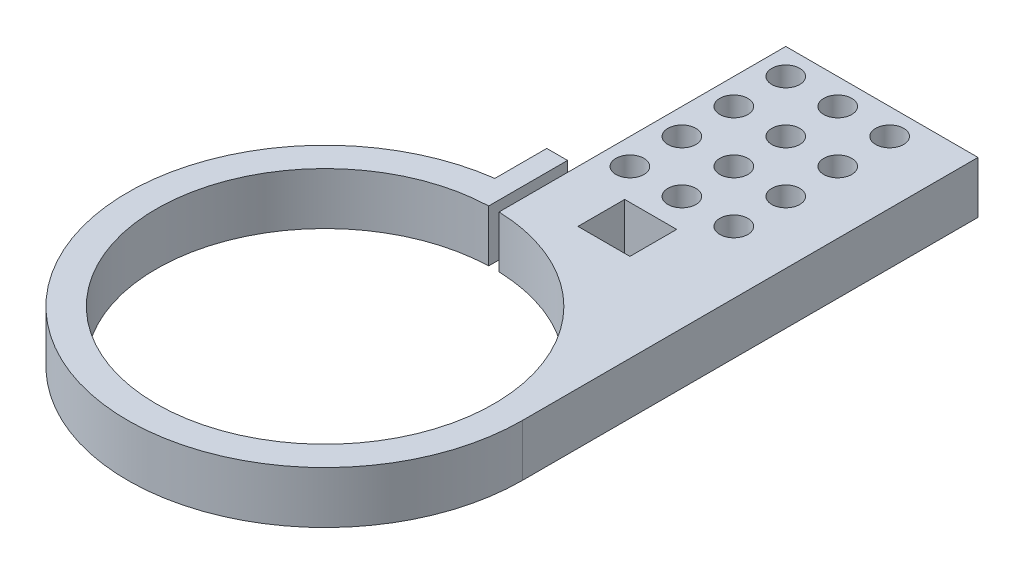
ISO-10303-21;
HEADER;
FILE_DESCRIPTION(('STEP AP214'),'2;1');
FILE_NAME('part.step','',(''),(''),'','','');
FILE_SCHEMA(('AUTOMOTIVE_DESIGN { 1 0 10303 214 1 1 1 1 }'));
ENDSEC;
DATA;
#1=APPLICATION_CONTEXT('core data for automotive mechanical design processes');
#2=APPLICATION_PROTOCOL_DEFINITION('international standard','automotive_design',2000,#1);
#3=PRODUCT_CONTEXT('',#1,'mechanical');
#4=PRODUCT('Part','Part','',(#3));
#5=PRODUCT_RELATED_PRODUCT_CATEGORY('part','',(#4));
#6=PRODUCT_DEFINITION_FORMATION('','',#4);
#7=PRODUCT_DEFINITION_CONTEXT('part definition',#1,'design');
#8=PRODUCT_DEFINITION('design','',#6,#7);
#9=PRODUCT_DEFINITION_SHAPE('','',#8);
#10=(LENGTH_UNIT() NAMED_UNIT(*) SI_UNIT(.MILLI.,.METRE.));
#11=(NAMED_UNIT(*) PLANE_ANGLE_UNIT() SI_UNIT($,.RADIAN.));
#12=(NAMED_UNIT(*) SI_UNIT($,.STERADIAN.) SOLID_ANGLE_UNIT());
#13=UNCERTAINTY_MEASURE_WITH_UNIT(LENGTH_MEASURE(1.E-05),#10,'distance_accuracy_value','');
#14=(GEOMETRIC_REPRESENTATION_CONTEXT(3) GLOBAL_UNCERTAINTY_ASSIGNED_CONTEXT((#13)) GLOBAL_UNIT_ASSIGNED_CONTEXT((#10,
#11,#12)) REPRESENTATION_CONTEXT('',''));
#15=CARTESIAN_POINT('',(0.,0.,0.));
#16=DIRECTION('',(0.,0.,1.));
#17=DIRECTION('',(1.,0.,0.));
#18=AXIS2_PLACEMENT_3D('',#15,#16,#17);
#19=CARTESIAN_POINT('',(0.,12.7,0.));
#20=DIRECTION('',(0.,-1.,0.));
#21=DIRECTION('',(0.,0.,-1.));
#22=AXIS2_PLACEMENT_3D('',#19,#20,#21);
#23=CYLINDRICAL_SURFACE('',#22,48.26);
#24=DIRECTION('',(0.,-1.,0.));
#25=VECTOR('',#24,1.);
#26=CARTESIAN_POINT('',(48.26,12.7,0.));
#27=LINE('',#26,#25);
#28=CARTESIAN_POINT('',(48.26,12.7,0.));
#29=VERTEX_POINT('',#28);
#30=CARTESIAN_POINT('',(48.26,0.,0.));
#31=VERTEX_POINT('',#30);
#32=EDGE_CURVE('E212',#29,#31,#27,.T.);
#33=ORIENTED_EDGE('',*,*,#32,.F.);
#34=CARTESIAN_POINT('',(0.,12.7,0.));
#35=DIRECTION('',(0.,1.,0.));
#36=DIRECTION('',(0.,0.,1.));
#37=AXIS2_PLACEMENT_3D('',#34,#35,#36);
#38=CIRCLE('',#37,48.26);
#39=CARTESIAN_POINT('',(-6.34999999999999,12.7,-47.8404128326669));
#40=VERTEX_POINT('',#39);
#41=EDGE_CURVE('E40',#40,#29,#38,.T.);
#42=ORIENTED_EDGE('',*,*,#41,.F.);
#43=DIRECTION('',(0.,-1.,0.));
#44=VECTOR('',#43,1.);
#45=CARTESIAN_POINT('',(-6.35,12.7,-47.8404128326669));
#46=LINE('',#45,#44);
#47=CARTESIAN_POINT('',(-6.35,0.,-47.8404128326669));
#48=VERTEX_POINT('',#47);
#49=EDGE_CURVE('E242',#40,#48,#46,.T.);
#50=ORIENTED_EDGE('',*,*,#49,.T.);
#51=CARTESIAN_POINT('',(0.,0.,0.));
#52=DIRECTION('',(0.,1.,0.));
#53=DIRECTION('',(0.,0.,1.));
#54=AXIS2_PLACEMENT_3D('',#51,#52,#53);
#55=CIRCLE('',#54,48.26);
#56=EDGE_CURVE('E249',#48,#31,#55,.T.);
#57=ORIENTED_EDGE('',*,*,#56,.T.);
#58=EDGE_LOOP('',(#33,#42,#50,#57));
#59=FACE_BOUND('',#58,.T.);
#60=ADVANCED_FACE('F33',(#59),#23,.T.);
#61=CARTESIAN_POINT('',(0.,12.7,0.));
#62=DIRECTION('',(0.,1.,0.));
#63=DIRECTION('',(0.,0.,1.));
#64=AXIS2_PLACEMENT_3D('',#61,#62,#63);
#65=PLANE('',#64);
#66=CARTESIAN_POINT('',(33.0200000000004,12.7,-66.8904128326669));
#67=DIRECTION('',(0.,1.,0.));
#68=DIRECTION('',(0.,0.,1.));
#69=AXIS2_PLACEMENT_3D('',#66,#67,#68);
#70=CIRCLE('',#69,3.42900000000001);
#71=CARTESIAN_POINT('',(33.0200000000004,12.7,-63.4614128326669));
#72=VERTEX_POINT('',#71);
#73=EDGE_CURVE('E185',#72,#72,#70,.T.);
#74=ORIENTED_EDGE('',*,*,#73,.F.);
#75=EDGE_LOOP('',(#74));
#76=FACE_BOUND('',#75,.T.);
#77=CARTESIAN_POINT('',(33.0200000000003,12.7,-79.5904128326669));
#78=DIRECTION('',(0.,1.,0.));
#79=DIRECTION('',(0.,0.,1.));
#80=AXIS2_PLACEMENT_3D('',#77,#78,#79);
#81=CIRCLE('',#80,3.42900000000001);
#82=CARTESIAN_POINT('',(33.0200000000003,12.7,-76.1614128326669));
#83=VERTEX_POINT('',#82);
#84=EDGE_CURVE('E179',#83,#83,#81,.T.);
#85=ORIENTED_EDGE('',*,*,#84,.F.);
#86=EDGE_LOOP('',(#85));
#87=FACE_BOUND('',#86,.T.);
#88=CARTESIAN_POINT('',(33.0200000000001,12.7,-92.2904128326669));
#89=DIRECTION('',(0.,1.,0.));
#90=DIRECTION('',(0.,0.,1.));
#91=AXIS2_PLACEMENT_3D('',#88,#89,#90);
#92=CIRCLE('',#91,3.42900000000001);
#93=CARTESIAN_POINT('',(33.0200000000001,12.7,-88.8614128326669));
#94=VERTEX_POINT('',#93);
#95=EDGE_CURVE('E173',#94,#94,#92,.T.);
#96=ORIENTED_EDGE('',*,*,#95,.F.);
#97=EDGE_LOOP('',(#96));
#98=FACE_BOUND('',#97,.T.);
#99=CARTESIAN_POINT('',(33.02,12.7,-104.990412832667));
#100=DIRECTION('',(0.,1.,0.));
#101=DIRECTION('',(0.,0.,1.));
#102=AXIS2_PLACEMENT_3D('',#99,#100,#101);
#103=CIRCLE('',#102,3.42900000000001);
#104=CARTESIAN_POINT('',(33.02,12.7,-101.561412832667));
#105=VERTEX_POINT('',#104);
#106=EDGE_CURVE('E166',#105,#105,#103,.T.);
#107=ORIENTED_EDGE('',*,*,#106,.F.);
#108=EDGE_LOOP('',(#107));
#109=FACE_BOUND('',#108,.T.);
#110=CARTESIAN_POINT('',(7.62000000000013,12.7,-92.2904128326669));
#111=DIRECTION('',(0.,1.,0.));
#112=DIRECTION('',(0.,0.,1.));
#113=AXIS2_PLACEMENT_3D('',#110,#111,#112);
#114=CIRCLE('',#113,3.42900000000001);
#115=CARTESIAN_POINT('',(7.62000000000013,12.7,-88.8614128326669));
#116=VERTEX_POINT('',#115);
#117=EDGE_CURVE('E570',#116,#116,#114,.T.);
#118=ORIENTED_EDGE('',*,*,#117,.F.);
#119=EDGE_LOOP('',(#118));
#120=FACE_BOUND('',#119,.T.);
#121=CARTESIAN_POINT('',(20.3200000000001,12.7,-92.2904128326669));
#122=DIRECTION('',(0.,1.,0.));
#123=DIRECTION('',(0.,0.,1.));
#124=AXIS2_PLACEMENT_3D('',#121,#122,#123);
#125=CIRCLE('',#124,3.42900000000002);
#126=CARTESIAN_POINT('',(20.3200000000001,12.7,-88.8614128326669));
#127=VERTEX_POINT('',#126);
#128=EDGE_CURVE('E165',#127,#127,#125,.T.);
#129=ORIENTED_EDGE('',*,*,#128,.F.);
#130=EDGE_LOOP('',(#129));
#131=FACE_BOUND('',#130,.T.);
#132=CARTESIAN_POINT('',(20.32,12.7,-104.990412832667));
#133=DIRECTION('',(0.,1.,0.));
#134=DIRECTION('',(0.,0.,1.));
#135=AXIS2_PLACEMENT_3D('',#132,#133,#134);
#136=CIRCLE('',#135,3.42900000000001);
#137=CARTESIAN_POINT('',(20.32,12.7,-101.561412832667));
#138=VERTEX_POINT('',#137);
#139=EDGE_CURVE('E150',#138,#138,#136,.T.);
#140=ORIENTED_EDGE('',*,*,#139,.F.);
#141=EDGE_LOOP('',(#140));
#142=FACE_BOUND('',#141,.T.);
#143=DIRECTION('',(1.,0.,0.));
#144=VECTOR('',#143,1.);
#145=CARTESIAN_POINT('',(13.97,12.7,-47.8404128326669));
#146=LINE('',#145,#144);
#147=CARTESIAN_POINT('',(13.97,12.7,-47.8404128326669));
#148=VERTEX_POINT('',#147);
#149=CARTESIAN_POINT('',(26.67,12.7,-47.8404128326669));
#150=VERTEX_POINT('',#149);
#151=EDGE_CURVE('E128',#148,#150,#146,.T.);
#152=ORIENTED_EDGE('',*,*,#151,.F.);
#153=DIRECTION('',(0.,0.,1.));
#154=VECTOR('',#153,1.);
#155=CARTESIAN_POINT('',(13.97,12.7,-59.2704128326669));
#156=LINE('',#155,#154);
#157=CARTESIAN_POINT('',(13.97,12.7,-59.2704128326669));
#158=VERTEX_POINT('',#157);
#159=EDGE_CURVE('E120',#158,#148,#156,.T.);
#160=ORIENTED_EDGE('',*,*,#159,.F.);
#161=DIRECTION('',(-1.,0.,0.));
#162=VECTOR('',#161,1.);
#163=CARTESIAN_POINT('',(13.97,12.7,-59.2704128326669));
#164=LINE('',#163,#162);
#165=CARTESIAN_POINT('',(26.67,12.7,-59.2704128326669));
#166=VERTEX_POINT('',#165);
#167=EDGE_CURVE('E144',#166,#158,#164,.T.);
#168=ORIENTED_EDGE('',*,*,#167,.F.);
#169=DIRECTION('',(0.,0.,-1.));
#170=VECTOR('',#169,1.);
#171=CARTESIAN_POINT('',(26.67,12.7,-59.2704128326669));
#172=LINE('',#171,#170);
#173=EDGE_CURVE('E142',#150,#166,#172,.T.);
#174=ORIENTED_EDGE('',*,*,#173,.F.);
#175=EDGE_LOOP('',(#152,#160,#168,#174));
#176=FACE_BOUND('',#175,.T.);
#177=CARTESIAN_POINT('',(7.62000000000027,12.7,-79.5904128326669));
#178=DIRECTION('',(0.,1.,0.));
#179=DIRECTION('',(0.,0.,1.));
#180=AXIS2_PLACEMENT_3D('',#177,#178,#179);
#181=CIRCLE('',#180,3.42900000000001);
#182=CARTESIAN_POINT('',(7.62000000000027,12.7,-76.1614128326669));
#183=VERTEX_POINT('',#182);
#184=EDGE_CURVE('E572',#183,#183,#181,.T.);
#185=ORIENTED_EDGE('',*,*,#184,.F.);
#186=EDGE_LOOP('',(#185));
#187=FACE_BOUND('',#186,.T.);
#188=CARTESIAN_POINT('',(20.3200000000003,12.7,-79.5904128326669));
#189=DIRECTION('',(0.,1.,0.));
#190=DIRECTION('',(0.,0.,1.));
#191=AXIS2_PLACEMENT_3D('',#188,#189,#190);
#192=CIRCLE('',#191,3.42900000000001);
#193=CARTESIAN_POINT('',(20.3200000000003,12.7,-76.1614128326669));
#194=VERTEX_POINT('',#193);
#195=EDGE_CURVE('E576',#194,#194,#192,.T.);
#196=ORIENTED_EDGE('',*,*,#195,.F.);
#197=EDGE_LOOP('',(#196));
#198=FACE_BOUND('',#197,.T.);
#199=CARTESIAN_POINT('',(7.6200000000004,12.7,-66.8904128326669));
#200=DIRECTION('',(0.,1.,0.));
#201=DIRECTION('',(0.,0.,1.));
#202=AXIS2_PLACEMENT_3D('',#199,#200,#201);
#203=CIRCLE('',#202,3.42900000000001);
#204=CARTESIAN_POINT('',(7.6200000000004,12.7,-63.4614128326669));
#205=VERTEX_POINT('',#204);
#206=EDGE_CURVE('E582',#205,#205,#203,.T.);
#207=ORIENTED_EDGE('',*,*,#206,.F.);
#208=EDGE_LOOP('',(#207));
#209=FACE_BOUND('',#208,.T.);
#210=CARTESIAN_POINT('',(20.3200000000004,12.7,-66.8904128326669));
#211=DIRECTION('',(0.,1.,0.));
#212=DIRECTION('',(0.,0.,1.));
#213=AXIS2_PLACEMENT_3D('',#210,#211,#212);
#214=CIRCLE('',#213,3.42900000000001);
#215=CARTESIAN_POINT('',(20.3200000000004,12.7,-63.4614128326669));
#216=VERTEX_POINT('',#215);
#217=EDGE_CURVE('E561',#216,#216,#214,.T.);
#218=ORIENTED_EDGE('',*,*,#217,.F.);
#219=EDGE_LOOP('',(#218));
#220=FACE_BOUND('',#219,.T.);
#221=CARTESIAN_POINT('',(7.62,12.7,-104.990412832667));
#222=DIRECTION('',(0.,1.,0.));
#223=DIRECTION('',(0.,0.,1.));
#224=AXIS2_PLACEMENT_3D('',#221,#222,#223);
#225=CIRCLE('',#224,3.42900000000001);
#226=CARTESIAN_POINT('',(7.62,12.7,-101.561412832667));
#227=VERTEX_POINT('',#226);
#228=EDGE_CURVE('E191',#227,#227,#225,.T.);
#229=ORIENTED_EDGE('',*,*,#228,.F.);
#230=EDGE_LOOP('',(#229));
#231=FACE_BOUND('',#230,.T.);
#232=ORIENTED_EDGE('',*,*,#41,.T.);
#233=DIRECTION('',(0.,0.,1.));
#234=VECTOR('',#233,1.);
#235=CARTESIAN_POINT('',(48.26,12.7,-60.5404128326669));
#236=LINE('',#235,#234);
#237=CARTESIAN_POINT('',(48.26,12.7,-111.340412832667));
#238=VERTEX_POINT('',#237);
#239=EDGE_CURVE('E206',#238,#29,#236,.T.);
#240=ORIENTED_EDGE('',*,*,#239,.F.);
#241=DIRECTION('',(-1.,0.,0.));
#242=VECTOR('',#241,1.);
#243=CARTESIAN_POINT('',(48.26,12.7,-111.340412832667));
#244=LINE('',#243,#242);
#245=CARTESIAN_POINT('',(1.27,12.7,-111.340412832667));
#246=VERTEX_POINT('',#245);
#247=EDGE_CURVE('E194',#238,#246,#244,.T.);
#248=ORIENTED_EDGE('',*,*,#247,.T.);
#249=DIRECTION('',(0.,0.,-1.));
#250=VECTOR('',#249,1.);
#251=CARTESIAN_POINT('',(1.27,12.7,-38.0718915256164));
#252=LINE('',#251,#250);
#253=CARTESIAN_POINT('',(1.27,12.7,-41.2554569117832));
#254=VERTEX_POINT('',#253);
#255=EDGE_CURVE('E215',#254,#246,#252,.T.);
#256=ORIENTED_EDGE('',*,*,#255,.F.);
#257=CARTESIAN_POINT('',(0.,12.7,0.));
#258=DIRECTION('',(0.,1.,0.));
#259=DIRECTION('',(0.,0.,1.));
#260=AXIS2_PLACEMENT_3D('',#257,#258,#259);
#261=CIRCLE('',#260,41.275);
#262=CARTESIAN_POINT('',(-1.27,12.7,-41.2554569117832));
#263=VERTEX_POINT('',#262);
#264=EDGE_CURVE('E246',#263,#254,#261,.T.);
#265=ORIENTED_EDGE('',*,*,#264,.F.);
#266=DIRECTION('',(0.,0.,1.));
#267=VECTOR('',#266,1.);
#268=CARTESIAN_POINT('',(-1.27,12.7,-38.0718915256164));
#269=LINE('',#268,#267);
#270=CARTESIAN_POINT('',(-1.27,12.7,-60.5404128326669));
#271=VERTEX_POINT('',#270);
#272=EDGE_CURVE('E217',#271,#263,#269,.T.);
#273=ORIENTED_EDGE('',*,*,#272,.F.);
#274=DIRECTION('',(-1.,0.,0.));
#275=VECTOR('',#274,1.);
#276=CARTESIAN_POINT('',(6.35,12.7,-60.5404128326669));
#277=LINE('',#276,#275);
#278=CARTESIAN_POINT('',(-6.35,12.7,-60.5404128326669));
#279=VERTEX_POINT('',#278);
#280=EDGE_CURVE('E233',#271,#279,#277,.T.);
#281=ORIENTED_EDGE('',*,*,#280,.T.);
#282=DIRECTION('',(0.,0.,1.));
#283=VECTOR('',#282,1.);
#284=CARTESIAN_POINT('',(-6.35,12.7,-60.5404128326669));
#285=LINE('',#284,#283);
#286=EDGE_CURVE('E230',#279,#40,#285,.T.);
#287=ORIENTED_EDGE('',*,*,#286,.T.);
#288=EDGE_LOOP('',(#232,#240,#248,#256,#265,#273,#281,#287));
#289=FACE_BOUND('',#288,.T.);
#290=ADVANCED_FACE('F140',(#76,#87,#98,#109,#120,#131,#142,#176,#187,#198,#209,#220,#231,#289),
#65,.T.);
#291=CARTESIAN_POINT('',(0.,0.,0.));
#292=DIRECTION('',(0.,1.,0.));
#293=DIRECTION('',(0.,0.,1.));
#294=AXIS2_PLACEMENT_3D('',#291,#292,#293);
#295=PLANE('',#294);
#296=CARTESIAN_POINT('',(33.0200000000004,0.,-66.8904128326669));
#297=DIRECTION('',(0.,1.,0.));
#298=DIRECTION('',(0.,0.,1.));
#299=AXIS2_PLACEMENT_3D('',#296,#297,#298);
#300=CIRCLE('',#299,3.42900000000001);
#301=CARTESIAN_POINT('',(33.0200000000004,0.,-63.4614128326669));
#302=VERTEX_POINT('',#301);
#303=EDGE_CURVE('E188',#302,#302,#300,.T.);
#304=ORIENTED_EDGE('',*,*,#303,.T.);
#305=EDGE_LOOP('',(#304));
#306=FACE_BOUND('',#305,.T.);
#307=CARTESIAN_POINT('',(33.0200000000003,0.,-79.5904128326669));
#308=DIRECTION('',(0.,1.,0.));
#309=DIRECTION('',(0.,0.,1.));
#310=AXIS2_PLACEMENT_3D('',#307,#308,#309);
#311=CIRCLE('',#310,3.42900000000001);
#312=CARTESIAN_POINT('',(33.0200000000003,0.,-76.1614128326669));
#313=VERTEX_POINT('',#312);
#314=EDGE_CURVE('E182',#313,#313,#311,.T.);
#315=ORIENTED_EDGE('',*,*,#314,.T.);
#316=EDGE_LOOP('',(#315));
#317=FACE_BOUND('',#316,.T.);
#318=CARTESIAN_POINT('',(33.0200000000001,0.,-92.2904128326669));
#319=DIRECTION('',(0.,1.,0.));
#320=DIRECTION('',(0.,0.,1.));
#321=AXIS2_PLACEMENT_3D('',#318,#319,#320);
#322=CIRCLE('',#321,3.42900000000001);
#323=CARTESIAN_POINT('',(33.0200000000001,0.,-88.8614128326669));
#324=VERTEX_POINT('',#323);
#325=EDGE_CURVE('E176',#324,#324,#322,.T.);
#326=ORIENTED_EDGE('',*,*,#325,.T.);
#327=EDGE_LOOP('',(#326));
#328=FACE_BOUND('',#327,.T.);
#329=CARTESIAN_POINT('',(33.02,0.,-104.990412832667));
#330=DIRECTION('',(0.,1.,0.));
#331=DIRECTION('',(0.,0.,1.));
#332=AXIS2_PLACEMENT_3D('',#329,#330,#331);
#333=CIRCLE('',#332,3.42900000000001);
#334=CARTESIAN_POINT('',(33.02,0.,-101.561412832667));
#335=VERTEX_POINT('',#334);
#336=EDGE_CURVE('E170',#335,#335,#333,.T.);
#337=ORIENTED_EDGE('',*,*,#336,.T.);
#338=EDGE_LOOP('',(#337));
#339=FACE_BOUND('',#338,.T.);
#340=CARTESIAN_POINT('',(7.62000000000013,0.,-92.2904128326669));
#341=DIRECTION('',(0.,1.,0.));
#342=DIRECTION('',(0.,0.,1.));
#343=AXIS2_PLACEMENT_3D('',#340,#341,#342);
#344=CIRCLE('',#343,3.42900000000001);
#345=CARTESIAN_POINT('',(7.62000000000013,0.,-88.8614128326669));
#346=VERTEX_POINT('',#345);
#347=EDGE_CURVE('E535',#346,#346,#344,.T.);
#348=ORIENTED_EDGE('',*,*,#347,.T.);
#349=EDGE_LOOP('',(#348));
#350=FACE_BOUND('',#349,.T.);
#351=CARTESIAN_POINT('',(20.3200000000001,0.,-92.2904128326669));
#352=DIRECTION('',(0.,1.,0.));
#353=DIRECTION('',(0.,0.,1.));
#354=AXIS2_PLACEMENT_3D('',#351,#352,#353);
#355=CIRCLE('',#354,3.42900000000002);
#356=CARTESIAN_POINT('',(20.3200000000001,0.,-88.8614128326669));
#357=VERTEX_POINT('',#356);
#358=EDGE_CURVE('E539',#357,#357,#355,.T.);
#359=ORIENTED_EDGE('',*,*,#358,.T.);
#360=EDGE_LOOP('',(#359));
#361=FACE_BOUND('',#360,.T.);
#362=CARTESIAN_POINT('',(20.32,0.,-104.990412832667));
#363=DIRECTION('',(0.,1.,0.));
#364=DIRECTION('',(0.,0.,1.));
#365=AXIS2_PLACEMENT_3D('',#362,#363,#364);
#366=CIRCLE('',#365,3.42900000000001);
#367=CARTESIAN_POINT('',(20.32,0.,-101.561412832667));
#368=VERTEX_POINT('',#367);
#369=EDGE_CURVE('E162',#368,#368,#366,.T.);
#370=ORIENTED_EDGE('',*,*,#369,.T.);
#371=EDGE_LOOP('',(#370));
#372=FACE_BOUND('',#371,.T.);
#373=DIRECTION('',(0.,0.,1.));
#374=VECTOR('',#373,1.);
#375=CARTESIAN_POINT('',(13.97,0.,-59.2704128326669));
#376=LINE('',#375,#374);
#377=CARTESIAN_POINT('',(13.97,0.,-59.2704128326669));
#378=VERTEX_POINT('',#377);
#379=CARTESIAN_POINT('',(13.97,0.,-47.8404128326669));
#380=VERTEX_POINT('',#379);
#381=EDGE_CURVE('E55',#378,#380,#376,.T.);
#382=ORIENTED_EDGE('',*,*,#381,.T.);
#383=DIRECTION('',(1.,0.,0.));
#384=VECTOR('',#383,1.);
#385=CARTESIAN_POINT('',(13.97,0.,-47.8404128326669));
#386=LINE('',#385,#384);
#387=CARTESIAN_POINT('',(26.67,0.,-47.8404128326669));
#388=VERTEX_POINT('',#387);
#389=EDGE_CURVE('E135',#380,#388,#386,.T.);
#390=ORIENTED_EDGE('',*,*,#389,.T.);
#391=DIRECTION('',(0.,0.,-1.));
#392=VECTOR('',#391,1.);
#393=CARTESIAN_POINT('',(26.67,0.,-59.2704128326669));
#394=LINE('',#393,#392);
#395=CARTESIAN_POINT('',(26.67,0.,-59.2704128326669));
#396=VERTEX_POINT('',#395);
#397=EDGE_CURVE('E152',#388,#396,#394,.T.);
#398=ORIENTED_EDGE('',*,*,#397,.T.);
#399=DIRECTION('',(-1.,0.,0.));
#400=VECTOR('',#399,1.);
#401=CARTESIAN_POINT('',(13.97,0.,-59.2704128326669));
#402=LINE('',#401,#400);
#403=EDGE_CURVE('E129',#396,#378,#402,.T.);
#404=ORIENTED_EDGE('',*,*,#403,.T.);
#405=EDGE_LOOP('',(#382,#390,#398,#404));
#406=FACE_BOUND('',#405,.T.);
#407=CARTESIAN_POINT('',(7.62000000000027,0.,-79.5904128326669));
#408=DIRECTION('',(0.,1.,0.));
#409=DIRECTION('',(0.,0.,1.));
#410=AXIS2_PLACEMENT_3D('',#407,#408,#409);
#411=CIRCLE('',#410,3.42900000000001);
#412=CARTESIAN_POINT('',(7.62000000000027,0.,-76.1614128326669));
#413=VERTEX_POINT('',#412);
#414=EDGE_CURVE('E546',#413,#413,#411,.T.);
#415=ORIENTED_EDGE('',*,*,#414,.T.);
#416=EDGE_LOOP('',(#415));
#417=FACE_BOUND('',#416,.T.);
#418=CARTESIAN_POINT('',(20.3200000000003,0.,-79.5904128326669));
#419=DIRECTION('',(0.,1.,0.));
#420=DIRECTION('',(0.,0.,1.));
#421=AXIS2_PLACEMENT_3D('',#418,#419,#420);
#422=CIRCLE('',#421,3.42900000000001);
#423=CARTESIAN_POINT('',(20.3200000000003,0.,-76.1614128326669));
#424=VERTEX_POINT('',#423);
#425=EDGE_CURVE('E550',#424,#424,#422,.T.);
#426=ORIENTED_EDGE('',*,*,#425,.T.);
#427=EDGE_LOOP('',(#426));
#428=FACE_BOUND('',#427,.T.);
#429=CARTESIAN_POINT('',(7.6200000000004,0.,-66.8904128326669));
#430=DIRECTION('',(0.,1.,0.));
#431=DIRECTION('',(0.,0.,1.));
#432=AXIS2_PLACEMENT_3D('',#429,#430,#431);
#433=CIRCLE('',#432,3.42900000000001);
#434=CARTESIAN_POINT('',(7.6200000000004,0.,-63.4614128326669));
#435=VERTEX_POINT('',#434);
#436=EDGE_CURVE('E554',#435,#435,#433,.T.);
#437=ORIENTED_EDGE('',*,*,#436,.T.);
#438=EDGE_LOOP('',(#437));
#439=FACE_BOUND('',#438,.T.);
#440=CARTESIAN_POINT('',(20.3200000000004,0.,-66.8904128326669));
#441=DIRECTION('',(0.,1.,0.));
#442=DIRECTION('',(0.,0.,1.));
#443=AXIS2_PLACEMENT_3D('',#440,#441,#442);
#444=CIRCLE('',#443,3.42900000000001);
#445=CARTESIAN_POINT('',(20.3200000000004,0.,-63.4614128326669));
#446=VERTEX_POINT('',#445);
#447=EDGE_CURVE('E169',#446,#446,#444,.T.);
#448=ORIENTED_EDGE('',*,*,#447,.T.);
#449=EDGE_LOOP('',(#448));
#450=FACE_BOUND('',#449,.T.);
#451=CARTESIAN_POINT('',(7.62,0.,-104.990412832667));
#452=DIRECTION('',(0.,1.,0.));
#453=DIRECTION('',(0.,0.,1.));
#454=AXIS2_PLACEMENT_3D('',#451,#452,#453);
#455=CIRCLE('',#454,3.42900000000001);
#456=CARTESIAN_POINT('',(7.62,0.,-101.561412832667));
#457=VERTEX_POINT('',#456);
#458=EDGE_CURVE('E136',#457,#457,#455,.T.);
#459=ORIENTED_EDGE('',*,*,#458,.T.);
#460=EDGE_LOOP('',(#459));
#461=FACE_BOUND('',#460,.T.);
#462=DIRECTION('',(0.,0.,-1.));
#463=VECTOR('',#462,1.);
#464=CARTESIAN_POINT('',(1.27,0.,-38.0718915256164));
#465=LINE('',#464,#463);
#466=CARTESIAN_POINT('',(1.27,0.,-41.2554569117832));
#467=VERTEX_POINT('',#466);
#468=CARTESIAN_POINT('',(1.27,0.,-111.340412832667));
#469=VERTEX_POINT('',#468);
#470=EDGE_CURVE('E211',#467,#469,#465,.T.);
#471=ORIENTED_EDGE('',*,*,#470,.T.);
#472=DIRECTION('',(-1.,0.,0.));
#473=VECTOR('',#472,1.);
#474=CARTESIAN_POINT('',(48.26,0.,-111.340412832667));
#475=LINE('',#474,#473);
#476=CARTESIAN_POINT('',(48.26,0.,-111.340412832667));
#477=VERTEX_POINT('',#476);
#478=EDGE_CURVE('E197',#477,#469,#475,.T.);
#479=ORIENTED_EDGE('',*,*,#478,.F.);
#480=DIRECTION('',(0.,0.,-1.));
#481=VECTOR('',#480,1.);
#482=CARTESIAN_POINT('',(48.26,0.,-60.5404128326669));
#483=LINE('',#482,#481);
#484=EDGE_CURVE('E209',#31,#477,#483,.T.);
#485=ORIENTED_EDGE('',*,*,#484,.F.);
#486=ORIENTED_EDGE('',*,*,#56,.F.);
#487=DIRECTION('',(0.,0.,1.));
#488=VECTOR('',#487,1.);
#489=CARTESIAN_POINT('',(-6.35,0.,-60.5404128326669));
#490=LINE('',#489,#488);
#491=CARTESIAN_POINT('',(-6.35,0.,-60.5404128326669));
#492=VERTEX_POINT('',#491);
#493=EDGE_CURVE('E229',#492,#48,#490,.T.);
#494=ORIENTED_EDGE('',*,*,#493,.F.);
#495=DIRECTION('',(-1.,0.,0.));
#496=VECTOR('',#495,1.);
#497=CARTESIAN_POINT('',(6.35,0.,-60.5404128326669));
#498=LINE('',#497,#496);
#499=CARTESIAN_POINT('',(-1.27,0.,-60.5404128326669));
#500=VERTEX_POINT('',#499);
#501=EDGE_CURVE('E234',#500,#492,#498,.T.);
#502=ORIENTED_EDGE('',*,*,#501,.F.);
#503=DIRECTION('',(0.,0.,1.));
#504=VECTOR('',#503,1.);
#505=CARTESIAN_POINT('',(-1.27,0.,-38.0718915256164));
#506=LINE('',#505,#504);
#507=CARTESIAN_POINT('',(-1.27,0.,-41.2554569117832));
#508=VERTEX_POINT('',#507);
#509=EDGE_CURVE('E218',#500,#508,#506,.T.);
#510=ORIENTED_EDGE('',*,*,#509,.T.);
#511=CARTESIAN_POINT('',(0.,0.,0.));
#512=DIRECTION('',(0.,1.,0.));
#513=DIRECTION('',(0.,0.,1.));
#514=AXIS2_PLACEMENT_3D('',#511,#512,#513);
#515=CIRCLE('',#514,41.275);
#516=EDGE_CURVE('E245',#508,#467,#515,.T.);
#517=ORIENTED_EDGE('',*,*,#516,.T.);
#518=EDGE_LOOP('',(#471,#479,#485,#486,#494,#502,#510,#517));
#519=FACE_BOUND('',#518,.T.);
#520=ADVANCED_FACE('F260',(#306,#317,#328,#339,#350,#361,#372,#406,#417,#428,#439,#450,#461,
#519),#295,.F.);
#521=CARTESIAN_POINT('',(0.,12.7,0.));
#522=DIRECTION('',(0.,-1.,0.));
#523=DIRECTION('',(0.,0.,-1.));
#524=AXIS2_PLACEMENT_3D('',#521,#522,#523);
#525=CYLINDRICAL_SURFACE('',#524,41.275);
#526=ORIENTED_EDGE('',*,*,#264,.T.);
#527=DIRECTION('',(0.,-1.,0.));
#528=VECTOR('',#527,1.);
#529=CARTESIAN_POINT('',(1.27,12.7,-41.2554569117832));
#530=LINE('',#529,#528);
#531=EDGE_CURVE('E226',#254,#467,#530,.T.);
#532=ORIENTED_EDGE('',*,*,#531,.T.);
#533=ORIENTED_EDGE('',*,*,#516,.F.);
#534=DIRECTION('',(0.,-1.,0.));
#535=VECTOR('',#534,1.);
#536=CARTESIAN_POINT('',(-1.27,12.7,-41.2554569117832));
#537=LINE('',#536,#535);
#538=EDGE_CURVE('E220',#508,#263,#537,.F.);
#539=ORIENTED_EDGE('',*,*,#538,.T.);
#540=EDGE_LOOP('',(#526,#532,#533,#539));
#541=FACE_BOUND('',#540,.T.);
#542=ADVANCED_FACE('F285',(#541),#525,.F.);
#543=CARTESIAN_POINT('',(6.35,12.7,-60.5404128326669));
#544=DIRECTION('',(0.,0.,1.));
#545=DIRECTION('',(1.,0.,0.));
#546=AXIS2_PLACEMENT_3D('',#543,#544,#545);
#547=PLANE('',#546);
#548=DIRECTION('',(0.,1.,0.));
#549=VECTOR('',#548,1.);
#550=CARTESIAN_POINT('',(-1.27,12.7,-60.5404128326669));
#551=LINE('',#550,#549);
#552=EDGE_CURVE('E11',#500,#271,#551,.T.);
#553=ORIENTED_EDGE('',*,*,#552,.F.);
#554=ORIENTED_EDGE('',*,*,#501,.T.);
#555=DIRECTION('',(0.,-1.,0.));
#556=VECTOR('',#555,1.);
#557=CARTESIAN_POINT('',(-6.35,12.7,-60.5404128326669));
#558=LINE('',#557,#556);
#559=EDGE_CURVE('E236',#279,#492,#558,.T.);
#560=ORIENTED_EDGE('',*,*,#559,.F.);
#561=ORIENTED_EDGE('',*,*,#280,.F.);
#562=EDGE_LOOP('',(#553,#554,#560,#561));
#563=FACE_BOUND('',#562,.T.);
#564=ADVANCED_FACE('F281',(#563),#547,.F.);
#565=CARTESIAN_POINT('',(-6.35,12.7,-60.5404128326669));
#566=DIRECTION('',(1.,0.,0.));
#567=DIRECTION('',(0.,0.,-1.));
#568=AXIS2_PLACEMENT_3D('',#565,#566,#567);
#569=PLANE('',#568);
#570=ORIENTED_EDGE('',*,*,#493,.T.);
#571=ORIENTED_EDGE('',*,*,#49,.F.);
#572=ORIENTED_EDGE('',*,*,#286,.F.);
#573=ORIENTED_EDGE('',*,*,#559,.T.);
#574=EDGE_LOOP('',(#570,#571,#572,#573));
#575=FACE_BOUND('',#574,.T.);
#576=ADVANCED_FACE('F278',(#575),#569,.F.);
#577=CARTESIAN_POINT('',(-1.27,12.7,-38.0718915256164));
#578=DIRECTION('',(1.,0.,0.));
#579=DIRECTION('',(0.,0.,-1.));
#580=AXIS2_PLACEMENT_3D('',#577,#578,#579);
#581=PLANE('',#580);
#582=ORIENTED_EDGE('',*,*,#509,.F.);
#583=ORIENTED_EDGE('',*,*,#552,.T.);
#584=ORIENTED_EDGE('',*,*,#272,.T.);
#585=ORIENTED_EDGE('',*,*,#538,.F.);
#586=EDGE_LOOP('',(#582,#583,#584,#585));
#587=FACE_BOUND('',#586,.T.);
#588=ADVANCED_FACE('F289',(#587),#581,.T.);
#589=CARTESIAN_POINT('',(1.27,12.7,-38.0718915256164));
#590=DIRECTION('',(-1.,0.,0.));
#591=DIRECTION('',(0.,0.,1.));
#592=AXIS2_PLACEMENT_3D('',#589,#590,#591);
#593=PLANE('',#592);
#594=ORIENTED_EDGE('',*,*,#255,.T.);
#595=DIRECTION('',(0.,1.,0.));
#596=VECTOR('',#595,1.);
#597=CARTESIAN_POINT('',(1.27,0.,-111.340412832667));
#598=LINE('',#597,#596);
#599=EDGE_CURVE('E203',#469,#246,#598,.T.);
#600=ORIENTED_EDGE('',*,*,#599,.F.);
#601=ORIENTED_EDGE('',*,*,#470,.F.);
#602=ORIENTED_EDGE('',*,*,#531,.F.);
#603=EDGE_LOOP('',(#594,#600,#601,#602));
#604=FACE_BOUND('',#603,.T.);
#605=ADVANCED_FACE('F287',(#604),#593,.T.);
#606=CARTESIAN_POINT('',(48.26,0.,0.));
#607=DIRECTION('',(-1.,0.,0.));
#608=DIRECTION('',(0.,0.,1.));
#609=AXIS2_PLACEMENT_3D('',#606,#607,#608);
#610=PLANE('',#609);
#611=ORIENTED_EDGE('',*,*,#484,.T.);
#612=DIRECTION('',(0.,1.,0.));
#613=VECTOR('',#612,1.);
#614=CARTESIAN_POINT('',(48.26,0.,-111.340412832667));
#615=LINE('',#614,#613);
#616=EDGE_CURVE('E200',#477,#238,#615,.T.);
#617=ORIENTED_EDGE('',*,*,#616,.T.);
#618=ORIENTED_EDGE('',*,*,#239,.T.);
#619=ORIENTED_EDGE('',*,*,#32,.T.);
#620=EDGE_LOOP('',(#611,#617,#618,#619));
#621=FACE_BOUND('',#620,.T.);
#622=ADVANCED_FACE('F265',(#621),#610,.F.);
#623=CARTESIAN_POINT('',(48.26,0.,-111.340412832667));
#624=DIRECTION('',(0.,0.,-1.));
#625=DIRECTION('',(-1.,0.,0.));
#626=AXIS2_PLACEMENT_3D('',#623,#624,#625);
#627=PLANE('',#626);
#628=ORIENTED_EDGE('',*,*,#247,.F.);
#629=ORIENTED_EDGE('',*,*,#616,.F.);
#630=ORIENTED_EDGE('',*,*,#478,.T.);
#631=ORIENTED_EDGE('',*,*,#599,.T.);
#632=EDGE_LOOP('',(#628,#629,#630,#631));
#633=FACE_BOUND('',#632,.T.);
#634=ADVANCED_FACE('F268',(#633),#627,.T.);
#635=CARTESIAN_POINT('',(7.62,12.7,-104.990412832667));
#636=DIRECTION('',(0.,-1.,0.));
#637=DIRECTION('',(0.,0.,-1.));
#638=AXIS2_PLACEMENT_3D('',#635,#636,#637);
#639=CYLINDRICAL_SURFACE('',#638,3.42900000000001);
#640=ORIENTED_EDGE('',*,*,#228,.T.);
#641=EDGE_LOOP('',(#640));
#642=FACE_BOUND('',#641,.T.);
#643=ORIENTED_EDGE('',*,*,#458,.F.);
#644=EDGE_LOOP('',(#643));
#645=FACE_BOUND('',#644,.T.);
#646=ADVANCED_FACE('F354',(#642,#645),#639,.F.);
#647=CARTESIAN_POINT('',(20.3200000000004,12.7,-66.8904128326669));
#648=DIRECTION('',(0.,-1.,0.));
#649=DIRECTION('',(0.,0.,-1.));
#650=AXIS2_PLACEMENT_3D('',#647,#648,#649);
#651=CYLINDRICAL_SURFACE('',#650,3.42900000000001);
#652=ORIENTED_EDGE('',*,*,#217,.T.);
#653=EDGE_LOOP('',(#652));
#654=FACE_BOUND('',#653,.T.);
#655=ORIENTED_EDGE('',*,*,#447,.F.);
#656=EDGE_LOOP('',(#655));
#657=FACE_BOUND('',#656,.T.);
#658=ADVANCED_FACE('F374',(#654,#657),#651,.F.);
#659=CARTESIAN_POINT('',(7.6200000000004,12.7,-66.8904128326669));
#660=DIRECTION('',(0.,-1.,0.));
#661=DIRECTION('',(0.,0.,-1.));
#662=AXIS2_PLACEMENT_3D('',#659,#660,#661);
#663=CYLINDRICAL_SURFACE('',#662,3.42900000000001);
#664=ORIENTED_EDGE('',*,*,#206,.T.);
#665=EDGE_LOOP('',(#664));
#666=FACE_BOUND('',#665,.T.);
#667=ORIENTED_EDGE('',*,*,#436,.F.);
#668=EDGE_LOOP('',(#667));
#669=FACE_BOUND('',#668,.T.);
#670=ADVANCED_FACE('F384',(#666,#669),#663,.F.);
#671=CARTESIAN_POINT('',(20.3200000000003,12.7,-79.5904128326669));
#672=DIRECTION('',(0.,-1.,0.));
#673=DIRECTION('',(0.,0.,-1.));
#674=AXIS2_PLACEMENT_3D('',#671,#672,#673);
#675=CYLINDRICAL_SURFACE('',#674,3.42900000000001);
#676=ORIENTED_EDGE('',*,*,#195,.T.);
#677=EDGE_LOOP('',(#676));
#678=FACE_BOUND('',#677,.T.);
#679=ORIENTED_EDGE('',*,*,#425,.F.);
#680=EDGE_LOOP('',(#679));
#681=FACE_BOUND('',#680,.T.);
#682=ADVANCED_FACE('F394',(#678,#681),#675,.F.);
#683=CARTESIAN_POINT('',(7.62000000000027,12.7,-79.5904128326669));
#684=DIRECTION('',(0.,-1.,0.));
#685=DIRECTION('',(0.,0.,-1.));
#686=AXIS2_PLACEMENT_3D('',#683,#684,#685);
#687=CYLINDRICAL_SURFACE('',#686,3.42900000000001);
#688=ORIENTED_EDGE('',*,*,#184,.T.);
#689=EDGE_LOOP('',(#688));
#690=FACE_BOUND('',#689,.T.);
#691=ORIENTED_EDGE('',*,*,#414,.F.);
#692=EDGE_LOOP('',(#691));
#693=FACE_BOUND('',#692,.T.);
#694=ADVANCED_FACE('F404',(#690,#693),#687,.F.);
#695=CARTESIAN_POINT('',(13.97,12.7,-59.2704128326669));
#696=DIRECTION('',(1.,0.,0.));
#697=DIRECTION('',(0.,0.,-1.));
#698=AXIS2_PLACEMENT_3D('',#695,#696,#697);
#699=PLANE('',#698);
#700=ORIENTED_EDGE('',*,*,#381,.F.);
#701=DIRECTION('',(0.,-1.,0.));
#702=VECTOR('',#701,1.);
#703=CARTESIAN_POINT('',(13.97,12.7,-59.2704128326669));
#704=LINE('',#703,#702);
#705=EDGE_CURVE('E124',#158,#378,#704,.T.);
#706=ORIENTED_EDGE('',*,*,#705,.F.);
#707=ORIENTED_EDGE('',*,*,#159,.T.);
#708=DIRECTION('',(0.,-1.,0.));
#709=VECTOR('',#708,1.);
#710=CARTESIAN_POINT('',(13.97,12.7,-47.8404128326669));
#711=LINE('',#710,#709);
#712=EDGE_CURVE('E123',#148,#380,#711,.T.);
#713=ORIENTED_EDGE('',*,*,#712,.T.);
#714=EDGE_LOOP('',(#700,#706,#707,#713));
#715=FACE_BOUND('',#714,.T.);
#716=ADVANCED_FACE('F122',(#715),#699,.T.);
#717=CARTESIAN_POINT('',(13.97,12.7,-47.8404128326669));
#718=DIRECTION('',(0.,0.,-1.));
#719=DIRECTION('',(-1.,0.,0.));
#720=AXIS2_PLACEMENT_3D('',#717,#718,#719);
#721=PLANE('',#720);
#722=ORIENTED_EDGE('',*,*,#389,.F.);
#723=ORIENTED_EDGE('',*,*,#712,.F.);
#724=ORIENTED_EDGE('',*,*,#151,.T.);
#725=DIRECTION('',(0.,-1.,0.));
#726=VECTOR('',#725,1.);
#727=CARTESIAN_POINT('',(26.67,12.7,-47.8404128326669));
#728=LINE('',#727,#726);
#729=EDGE_CURVE('E137',#150,#388,#728,.T.);
#730=ORIENTED_EDGE('',*,*,#729,.T.);
#731=EDGE_LOOP('',(#722,#723,#724,#730));
#732=FACE_BOUND('',#731,.T.);
#733=ADVANCED_FACE('F132',(#732),#721,.T.);
#734=CARTESIAN_POINT('',(26.67,12.7,-59.2704128326669));
#735=DIRECTION('',(-1.,0.,0.));
#736=DIRECTION('',(0.,0.,1.));
#737=AXIS2_PLACEMENT_3D('',#734,#735,#736);
#738=PLANE('',#737);
#739=ORIENTED_EDGE('',*,*,#397,.F.);
#740=ORIENTED_EDGE('',*,*,#729,.F.);
#741=ORIENTED_EDGE('',*,*,#173,.T.);
#742=DIRECTION('',(0.,-1.,0.));
#743=VECTOR('',#742,1.);
#744=CARTESIAN_POINT('',(26.67,12.7,-59.2704128326669));
#745=LINE('',#744,#743);
#746=EDGE_CURVE('E47',#166,#396,#745,.T.);
#747=ORIENTED_EDGE('',*,*,#746,.T.);
#748=EDGE_LOOP('',(#739,#740,#741,#747));
#749=FACE_BOUND('',#748,.T.);
#750=ADVANCED_FACE('F431',(#749),#738,.T.);
#751=CARTESIAN_POINT('',(13.97,12.7,-59.2704128326669));
#752=DIRECTION('',(0.,0.,1.));
#753=DIRECTION('',(1.,0.,0.));
#754=AXIS2_PLACEMENT_3D('',#751,#752,#753);
#755=PLANE('',#754);
#756=ORIENTED_EDGE('',*,*,#403,.F.);
#757=ORIENTED_EDGE('',*,*,#746,.F.);
#758=ORIENTED_EDGE('',*,*,#167,.T.);
#759=ORIENTED_EDGE('',*,*,#705,.T.);
#760=EDGE_LOOP('',(#756,#757,#758,#759));
#761=FACE_BOUND('',#760,.T.);
#762=ADVANCED_FACE('F440',(#761),#755,.T.);
#763=CARTESIAN_POINT('',(20.32,12.7,-104.990412832667));
#764=DIRECTION('',(0.,-1.,0.));
#765=DIRECTION('',(0.,0.,-1.));
#766=AXIS2_PLACEMENT_3D('',#763,#764,#765);
#767=CYLINDRICAL_SURFACE('',#766,3.42900000000001);
#768=ORIENTED_EDGE('',*,*,#139,.T.);
#769=EDGE_LOOP('',(#768));
#770=FACE_BOUND('',#769,.T.);
#771=ORIENTED_EDGE('',*,*,#369,.F.);
#772=EDGE_LOOP('',(#771));
#773=FACE_BOUND('',#772,.T.);
#774=ADVANCED_FACE('F450',(#770,#773),#767,.F.);
#775=CARTESIAN_POINT('',(20.3200000000001,12.7,-92.2904128326669));
#776=DIRECTION('',(0.,-1.,0.));
#777=DIRECTION('',(0.,0.,-1.));
#778=AXIS2_PLACEMENT_3D('',#775,#776,#777);
#779=CYLINDRICAL_SURFACE('',#778,3.42900000000002);
#780=ORIENTED_EDGE('',*,*,#128,.T.);
#781=EDGE_LOOP('',(#780));
#782=FACE_BOUND('',#781,.T.);
#783=ORIENTED_EDGE('',*,*,#358,.F.);
#784=EDGE_LOOP('',(#783));
#785=FACE_BOUND('',#784,.T.);
#786=ADVANCED_FACE('F459',(#782,#785),#779,.F.);
#787=CARTESIAN_POINT('',(7.62000000000013,12.7,-92.2904128326669));
#788=DIRECTION('',(0.,-1.,0.));
#789=DIRECTION('',(0.,0.,-1.));
#790=AXIS2_PLACEMENT_3D('',#787,#788,#789);
#791=CYLINDRICAL_SURFACE('',#790,3.42900000000001);
#792=ORIENTED_EDGE('',*,*,#117,.T.);
#793=EDGE_LOOP('',(#792));
#794=FACE_BOUND('',#793,.T.);
#795=ORIENTED_EDGE('',*,*,#347,.F.);
#796=EDGE_LOOP('',(#795));
#797=FACE_BOUND('',#796,.T.);
#798=ADVANCED_FACE('F469',(#794,#797),#791,.F.);
#799=CARTESIAN_POINT('',(33.02,12.7,-104.990412832667));
#800=DIRECTION('',(0.,-1.,0.));
#801=DIRECTION('',(0.,0.,-1.));
#802=AXIS2_PLACEMENT_3D('',#799,#800,#801);
#803=CYLINDRICAL_SURFACE('',#802,3.42900000000001);
#804=ORIENTED_EDGE('',*,*,#106,.T.);
#805=EDGE_LOOP('',(#804));
#806=FACE_BOUND('',#805,.T.);
#807=ORIENTED_EDGE('',*,*,#336,.F.);
#808=EDGE_LOOP('',(#807));
#809=FACE_BOUND('',#808,.T.);
#810=ADVANCED_FACE('F479',(#806,#809),#803,.F.);
#811=CARTESIAN_POINT('',(33.0200000000001,12.7,-92.2904128326669));
#812=DIRECTION('',(0.,-1.,0.));
#813=DIRECTION('',(0.,0.,-1.));
#814=AXIS2_PLACEMENT_3D('',#811,#812,#813);
#815=CYLINDRICAL_SURFACE('',#814,3.42900000000001);
#816=ORIENTED_EDGE('',*,*,#95,.T.);
#817=EDGE_LOOP('',(#816));
#818=FACE_BOUND('',#817,.T.);
#819=ORIENTED_EDGE('',*,*,#325,.F.);
#820=EDGE_LOOP('',(#819));
#821=FACE_BOUND('',#820,.T.);
#822=ADVANCED_FACE('F489',(#818,#821),#815,.F.);
#823=CARTESIAN_POINT('',(33.0200000000003,12.7,-79.5904128326669));
#824=DIRECTION('',(0.,-1.,0.));
#825=DIRECTION('',(0.,0.,-1.));
#826=AXIS2_PLACEMENT_3D('',#823,#824,#825);
#827=CYLINDRICAL_SURFACE('',#826,3.42900000000001);
#828=ORIENTED_EDGE('',*,*,#84,.T.);
#829=EDGE_LOOP('',(#828));
#830=FACE_BOUND('',#829,.T.);
#831=ORIENTED_EDGE('',*,*,#314,.F.);
#832=EDGE_LOOP('',(#831));
#833=FACE_BOUND('',#832,.T.);
#834=ADVANCED_FACE('F499',(#830,#833),#827,.F.);
#835=CARTESIAN_POINT('',(33.0200000000004,12.7,-66.8904128326669));
#836=DIRECTION('',(0.,-1.,0.));
#837=DIRECTION('',(0.,0.,-1.));
#838=AXIS2_PLACEMENT_3D('',#835,#836,#837);
#839=CYLINDRICAL_SURFACE('',#838,3.42900000000001);
#840=ORIENTED_EDGE('',*,*,#73,.T.);
#841=EDGE_LOOP('',(#840));
#842=FACE_BOUND('',#841,.T.);
#843=ORIENTED_EDGE('',*,*,#303,.F.);
#844=EDGE_LOOP('',(#843));
#845=FACE_BOUND('',#844,.T.);
#846=ADVANCED_FACE('F509',(#842,#845),#839,.F.);
#847=CLOSED_SHELL('',(#60,#290,#520,#542,#564,#576,#588,#605,#622,#634,#646,#658,#670,#682,#694,
#716,#733,#750,#762,#774,#786,#798,#810,#822,#834,#846));
#848=MANIFOLD_SOLID_BREP('B2',#847);
#849=ADVANCED_BREP_SHAPE_REPRESENTATION('',(#18,#848),#14);
#850=SHAPE_DEFINITION_REPRESENTATION(#9,#849);
ENDSEC;
END-ISO-10303-21;
